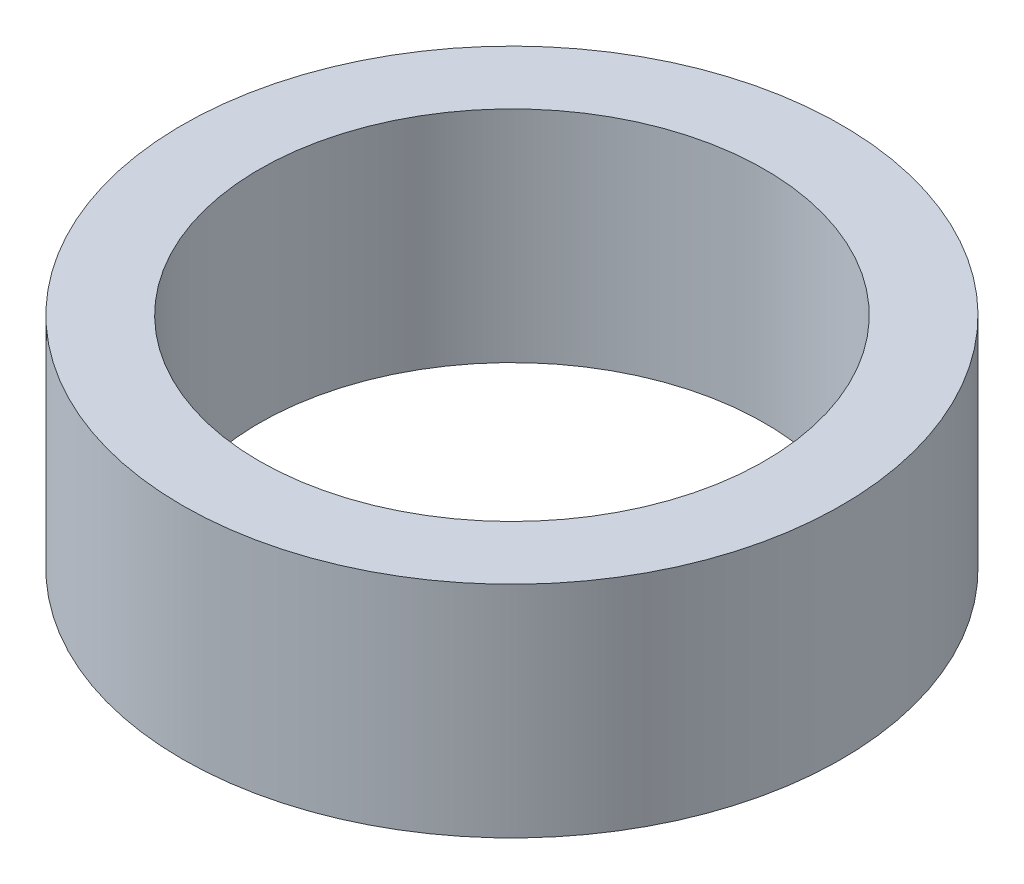
ISO-10303-21;
HEADER;
FILE_DESCRIPTION(('STEP AP214'),'2;1');
FILE_NAME('part.step','',(''),(''),'','','');
FILE_SCHEMA(('AUTOMOTIVE_DESIGN { 1 0 10303 214 1 1 1 1 }'));
ENDSEC;
DATA;
#1=APPLICATION_CONTEXT('core data for automotive mechanical design processes');
#2=APPLICATION_PROTOCOL_DEFINITION('international standard','automotive_design',2000,#1);
#3=PRODUCT_CONTEXT('',#1,'mechanical');
#4=PRODUCT('Part','Part','',(#3));
#5=PRODUCT_RELATED_PRODUCT_CATEGORY('part','',(#4));
#6=PRODUCT_DEFINITION_FORMATION('','',#4);
#7=PRODUCT_DEFINITION_CONTEXT('part definition',#1,'design');
#8=PRODUCT_DEFINITION('design','',#6,#7);
#9=PRODUCT_DEFINITION_SHAPE('','',#8);
#10=(LENGTH_UNIT() NAMED_UNIT(*) SI_UNIT(.MILLI.,.METRE.));
#11=(NAMED_UNIT(*) PLANE_ANGLE_UNIT() SI_UNIT($,.RADIAN.));
#12=(NAMED_UNIT(*) SI_UNIT($,.STERADIAN.) SOLID_ANGLE_UNIT());
#13=UNCERTAINTY_MEASURE_WITH_UNIT(LENGTH_MEASURE(1.E-05),#10,'distance_accuracy_value','');
#14=(GEOMETRIC_REPRESENTATION_CONTEXT(3) GLOBAL_UNCERTAINTY_ASSIGNED_CONTEXT((#13)) GLOBAL_UNIT_ASSIGNED_CONTEXT((#10,
#11,#12)) REPRESENTATION_CONTEXT('',''));
#15=CARTESIAN_POINT('',(0.,0.,0.));
#16=DIRECTION('',(0.,0.,1.));
#17=DIRECTION('',(1.,0.,0.));
#18=AXIS2_PLACEMENT_3D('',#15,#16,#17);
#19=CARTESIAN_POINT('',(0.,12.7,0.));
#20=DIRECTION('',(0.,-1.,0.));
#21=DIRECTION('',(0.,0.,-1.));
#22=AXIS2_PLACEMENT_3D('',#19,#20,#21);
#23=CYLINDRICAL_SURFACE('',#22,19.05);
#24=CARTESIAN_POINT('',(0.,12.7,0.));
#25=DIRECTION('',(0.,1.,0.));
#26=DIRECTION('',(0.,0.,1.));
#27=AXIS2_PLACEMENT_3D('',#24,#25,#26);
#28=CIRCLE('',#27,19.05);
#29=CARTESIAN_POINT('',(0.,12.7,19.05));
#30=VERTEX_POINT('',#29);
#31=EDGE_CURVE('E10',#30,#30,#28,.T.);
#32=ORIENTED_EDGE('',*,*,#31,.F.);
#33=EDGE_LOOP('',(#32));
#34=FACE_BOUND('',#33,.T.);
#35=CARTESIAN_POINT('',(0.,0.,0.));
#36=DIRECTION('',(0.,1.,0.));
#37=DIRECTION('',(0.,0.,1.));
#38=AXIS2_PLACEMENT_3D('',#35,#36,#37);
#39=CIRCLE('',#38,19.05);
#40=CARTESIAN_POINT('',(0.,0.,19.05));
#41=VERTEX_POINT('',#40);
#42=EDGE_CURVE('E35',#41,#41,#39,.T.);
#43=ORIENTED_EDGE('',*,*,#42,.T.);
#44=EDGE_LOOP('',(#43));
#45=FACE_BOUND('',#44,.T.);
#46=ADVANCED_FACE('F32',(#34,#45),#23,.T.);
#47=CARTESIAN_POINT('',(0.,12.7,0.));
#48=DIRECTION('',(0.,1.,0.));
#49=DIRECTION('',(0.,0.,1.));
#50=AXIS2_PLACEMENT_3D('',#47,#48,#49);
#51=PLANE('',#50);
#52=CARTESIAN_POINT('',(0.,12.7,0.));
#53=DIRECTION('',(0.,1.,0.));
#54=DIRECTION('',(0.,0.,1.));
#55=AXIS2_PLACEMENT_3D('',#52,#53,#54);
#56=CIRCLE('',#55,14.605);
#57=CARTESIAN_POINT('',(0.,12.7,14.605));
#58=VERTEX_POINT('',#57);
#59=EDGE_CURVE('E44',#58,#58,#56,.T.);
#60=ORIENTED_EDGE('',*,*,#59,.F.);
#61=EDGE_LOOP('',(#60));
#62=FACE_BOUND('',#61,.T.);
#63=ORIENTED_EDGE('',*,*,#31,.T.);
#64=EDGE_LOOP('',(#63));
#65=FACE_BOUND('',#64,.T.);
#66=ADVANCED_FACE('F59',(#62,#65),#51,.T.);
#67=CARTESIAN_POINT('',(0.,0.,0.));
#68=DIRECTION('',(0.,1.,0.));
#69=DIRECTION('',(0.,0.,1.));
#70=AXIS2_PLACEMENT_3D('',#67,#68,#69);
#71=PLANE('',#70);
#72=CARTESIAN_POINT('',(0.,0.,0.));
#73=DIRECTION('',(0.,1.,0.));
#74=DIRECTION('',(0.,0.,1.));
#75=AXIS2_PLACEMENT_3D('',#72,#73,#74);
#76=CIRCLE('',#75,14.605);
#77=CARTESIAN_POINT('',(0.,0.,14.605));
#78=VERTEX_POINT('',#77);
#79=EDGE_CURVE('E42',#78,#78,#76,.T.);
#80=ORIENTED_EDGE('',*,*,#79,.T.);
#81=EDGE_LOOP('',(#80));
#82=FACE_BOUND('',#81,.T.);
#83=ORIENTED_EDGE('',*,*,#42,.F.);
#84=EDGE_LOOP('',(#83));
#85=FACE_BOUND('',#84,.T.);
#86=ADVANCED_FACE('F50',(#82,#85),#71,.F.);
#87=CARTESIAN_POINT('',(0.,0.,0.));
#88=DIRECTION('',(0.,1.,0.));
#89=DIRECTION('',(0.,0.,1.));
#90=AXIS2_PLACEMENT_3D('',#87,#88,#89);
#91=CYLINDRICAL_SURFACE('',#90,14.605);
#92=ORIENTED_EDGE('',*,*,#79,.F.);
#93=EDGE_LOOP('',(#92));
#94=FACE_BOUND('',#93,.T.);
#95=ORIENTED_EDGE('',*,*,#59,.T.);
#96=EDGE_LOOP('',(#95));
#97=FACE_BOUND('',#96,.T.);
#98=ADVANCED_FACE('F53',(#94,#97),#91,.F.);
#99=CLOSED_SHELL('',(#46,#66,#86,#98));
#100=MANIFOLD_SOLID_BREP('B2',#99);
#101=ADVANCED_BREP_SHAPE_REPRESENTATION('',(#18,#100),#14);
#102=SHAPE_DEFINITION_REPRESENTATION(#9,#101);
ENDSEC;
END-ISO-10303-21;
